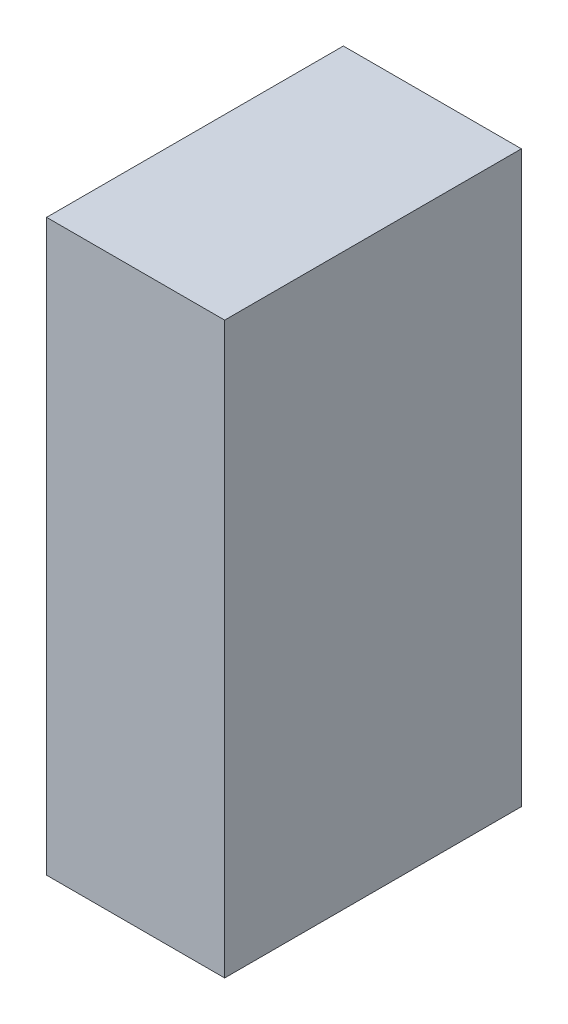
ISO-10303-21;
HEADER;
FILE_DESCRIPTION(('STEP AP214'),'2;1');
FILE_NAME('part.step','',(''),(''),'','','');
FILE_SCHEMA(('AUTOMOTIVE_DESIGN { 1 0 10303 214 1 1 1 1 }'));
ENDSEC;
DATA;
#1=APPLICATION_CONTEXT('core data for automotive mechanical design processes');
#2=APPLICATION_PROTOCOL_DEFINITION('international standard','automotive_design',2000,#1);
#3=PRODUCT_CONTEXT('',#1,'mechanical');
#4=PRODUCT('Part','Part','',(#3));
#5=PRODUCT_RELATED_PRODUCT_CATEGORY('part','',(#4));
#6=PRODUCT_DEFINITION_FORMATION('','',#4);
#7=PRODUCT_DEFINITION_CONTEXT('part definition',#1,'design');
#8=PRODUCT_DEFINITION('design','',#6,#7);
#9=PRODUCT_DEFINITION_SHAPE('','',#8);
#10=(LENGTH_UNIT() NAMED_UNIT(*) SI_UNIT(.MILLI.,.METRE.));
#11=(NAMED_UNIT(*) PLANE_ANGLE_UNIT() SI_UNIT($,.RADIAN.));
#12=(NAMED_UNIT(*) SI_UNIT($,.STERADIAN.) SOLID_ANGLE_UNIT());
#13=UNCERTAINTY_MEASURE_WITH_UNIT(LENGTH_MEASURE(1.E-05),#10,'distance_accuracy_value','');
#14=(GEOMETRIC_REPRESENTATION_CONTEXT(3) GLOBAL_UNCERTAINTY_ASSIGNED_CONTEXT((#13)) GLOBAL_UNIT_ASSIGNED_CONTEXT((#10,
#11,#12)) REPRESENTATION_CONTEXT('',''));
#15=CARTESIAN_POINT('',(0.,0.,0.));
#16=DIRECTION('',(0.,0.,1.));
#17=DIRECTION('',(1.,0.,0.));
#18=AXIS2_PLACEMENT_3D('',#15,#16,#17);
#19=CARTESIAN_POINT('',(0.,48.,0.));
#20=DIRECTION('',(1.,0.,0.));
#21=DIRECTION('',(0.,0.,-1.));
#22=AXIS2_PLACEMENT_3D('',#19,#20,#21);
#23=PLANE('',#22);
#24=DIRECTION('',(0.,0.,1.));
#25=VECTOR('',#24,1.);
#26=CARTESIAN_POINT('',(0.,0.,0.));
#27=LINE('',#26,#25);
#28=CARTESIAN_POINT('',(0.,0.,-25.));
#29=VERTEX_POINT('',#28);
#30=CARTESIAN_POINT('',(0.,0.,0.));
#31=VERTEX_POINT('',#30);
#32=EDGE_CURVE('E100',#29,#31,#27,.T.);
#33=ORIENTED_EDGE('',*,*,#32,.T.);
#34=DIRECTION('',(0.,-1.,0.));
#35=VECTOR('',#34,1.);
#36=CARTESIAN_POINT('',(0.,48.,0.));
#37=LINE('',#36,#35);
#38=CARTESIAN_POINT('',(0.,48.,0.));
#39=VERTEX_POINT('',#38);
#40=EDGE_CURVE('E11',#39,#31,#37,.T.);
#41=ORIENTED_EDGE('',*,*,#40,.F.);
#42=DIRECTION('',(0.,0.,1.));
#43=VECTOR('',#42,1.);
#44=CARTESIAN_POINT('',(0.,48.,0.));
#45=LINE('',#44,#43);
#46=CARTESIAN_POINT('',(0.,48.,-25.));
#47=VERTEX_POINT('',#46);
#48=EDGE_CURVE('E88',#47,#39,#45,.T.);
#49=ORIENTED_EDGE('',*,*,#48,.F.);
#50=DIRECTION('',(0.,-1.,0.));
#51=VECTOR('',#50,1.);
#52=CARTESIAN_POINT('',(0.,48.,-25.));
#53=LINE('',#52,#51);
#54=EDGE_CURVE('E96',#47,#29,#53,.T.);
#55=ORIENTED_EDGE('',*,*,#54,.T.);
#56=EDGE_LOOP('',(#33,#41,#49,#55));
#57=FACE_BOUND('',#56,.T.);
#58=ADVANCED_FACE('F37',(#57),#23,.F.);
#59=CARTESIAN_POINT('',(0.,48.,0.));
#60=DIRECTION('',(0.,0.,-1.));
#61=DIRECTION('',(-1.,0.,0.));
#62=AXIS2_PLACEMENT_3D('',#59,#60,#61);
#63=PLANE('',#62);
#64=DIRECTION('',(1.,0.,0.));
#65=VECTOR('',#64,1.);
#66=CARTESIAN_POINT('',(0.,0.,0.));
#67=LINE('',#66,#65);
#68=CARTESIAN_POINT('',(15.,0.,0.));
#69=VERTEX_POINT('',#68);
#70=EDGE_CURVE('E92',#31,#69,#67,.T.);
#71=ORIENTED_EDGE('',*,*,#70,.T.);
#72=DIRECTION('',(0.,-1.,0.));
#73=VECTOR('',#72,1.);
#74=CARTESIAN_POINT('',(15.,48.,0.));
#75=LINE('',#74,#73);
#76=CARTESIAN_POINT('',(15.,48.,0.));
#77=VERTEX_POINT('',#76);
#78=EDGE_CURVE('E45',#77,#69,#75,.T.);
#79=ORIENTED_EDGE('',*,*,#78,.F.);
#80=DIRECTION('',(1.,0.,0.));
#81=VECTOR('',#80,1.);
#82=CARTESIAN_POINT('',(0.,48.,0.));
#83=LINE('',#82,#81);
#84=EDGE_CURVE('E83',#39,#77,#83,.T.);
#85=ORIENTED_EDGE('',*,*,#84,.F.);
#86=ORIENTED_EDGE('',*,*,#40,.T.);
#87=EDGE_LOOP('',(#71,#79,#85,#86));
#88=FACE_BOUND('',#87,.T.);
#89=ADVANCED_FACE('F91',(#88),#63,.F.);
#90=CARTESIAN_POINT('',(15.,48.,0.));
#91=DIRECTION('',(-1.,0.,0.));
#92=DIRECTION('',(0.,0.,1.));
#93=AXIS2_PLACEMENT_3D('',#90,#91,#92);
#94=PLANE('',#93);
#95=DIRECTION('',(0.,0.,-1.));
#96=VECTOR('',#95,1.);
#97=CARTESIAN_POINT('',(15.,0.,0.));
#98=LINE('',#97,#96);
#99=CARTESIAN_POINT('',(15.,0.,-25.));
#100=VERTEX_POINT('',#99);
#101=EDGE_CURVE('E70',#69,#100,#98,.T.);
#102=ORIENTED_EDGE('',*,*,#101,.T.);
#103=DIRECTION('',(0.,-1.,0.));
#104=VECTOR('',#103,1.);
#105=CARTESIAN_POINT('',(15.,48.,-25.));
#106=LINE('',#105,#104);
#107=CARTESIAN_POINT('',(15.,48.,-25.));
#108=VERTEX_POINT('',#107);
#109=EDGE_CURVE('E93',#108,#100,#106,.T.);
#110=ORIENTED_EDGE('',*,*,#109,.F.);
#111=DIRECTION('',(0.,0.,-1.));
#112=VECTOR('',#111,1.);
#113=CARTESIAN_POINT('',(15.,48.,0.));
#114=LINE('',#113,#112);
#115=EDGE_CURVE('E86',#77,#108,#114,.T.);
#116=ORIENTED_EDGE('',*,*,#115,.F.);
#117=ORIENTED_EDGE('',*,*,#78,.T.);
#118=EDGE_LOOP('',(#102,#110,#116,#117));
#119=FACE_BOUND('',#118,.T.);
#120=ADVANCED_FACE('F94',(#119),#94,.F.);
#121=CARTESIAN_POINT('',(0.,48.,-25.));
#122=DIRECTION('',(0.,0.,1.));
#123=DIRECTION('',(1.,0.,0.));
#124=AXIS2_PLACEMENT_3D('',#121,#122,#123);
#125=PLANE('',#124);
#126=DIRECTION('',(-1.,0.,0.));
#127=VECTOR('',#126,1.);
#128=CARTESIAN_POINT('',(0.,0.,-25.));
#129=LINE('',#128,#127);
#130=EDGE_CURVE('E76',#100,#29,#129,.T.);
#131=ORIENTED_EDGE('',*,*,#130,.T.);
#132=ORIENTED_EDGE('',*,*,#54,.F.);
#133=DIRECTION('',(-1.,0.,0.));
#134=VECTOR('',#133,1.);
#135=CARTESIAN_POINT('',(0.,48.,-25.));
#136=LINE('',#135,#134);
#137=EDGE_CURVE('E53',#108,#47,#136,.T.);
#138=ORIENTED_EDGE('',*,*,#137,.F.);
#139=ORIENTED_EDGE('',*,*,#109,.T.);
#140=EDGE_LOOP('',(#131,#132,#138,#139));
#141=FACE_BOUND('',#140,.T.);
#142=ADVANCED_FACE('F107',(#141),#125,.F.);
#143=CARTESIAN_POINT('',(0.,48.,0.));
#144=DIRECTION('',(0.,-1.,0.));
#145=DIRECTION('',(0.,0.,-1.));
#146=AXIS2_PLACEMENT_3D('',#143,#144,#145);
#147=PLANE('',#146);
#148=ORIENTED_EDGE('',*,*,#48,.T.);
#149=ORIENTED_EDGE('',*,*,#84,.T.);
#150=ORIENTED_EDGE('',*,*,#115,.T.);
#151=ORIENTED_EDGE('',*,*,#137,.T.);
#152=EDGE_LOOP('',(#148,#149,#150,#151));
#153=FACE_BOUND('',#152,.T.);
#154=ADVANCED_FACE('F84',(#153),#147,.F.);
#155=CARTESIAN_POINT('',(0.,0.,0.));
#156=DIRECTION('',(0.,-1.,0.));
#157=DIRECTION('',(0.,0.,-1.));
#158=AXIS2_PLACEMENT_3D('',#155,#156,#157);
#159=PLANE('',#158);
#160=ORIENTED_EDGE('',*,*,#32,.F.);
#161=ORIENTED_EDGE('',*,*,#130,.F.);
#162=ORIENTED_EDGE('',*,*,#101,.F.);
#163=ORIENTED_EDGE('',*,*,#70,.F.);
#164=EDGE_LOOP('',(#160,#161,#162,#163));
#165=FACE_BOUND('',#164,.T.);
#166=ADVANCED_FACE('F110',(#165),#159,.T.);
#167=CLOSED_SHELL('',(#58,#89,#120,#142,#154,#166));
#168=MANIFOLD_SOLID_BREP('B2',#167);
#169=ADVANCED_BREP_SHAPE_REPRESENTATION('',(#18,#168),#14);
#170=SHAPE_DEFINITION_REPRESENTATION(#9,#169);
ENDSEC;
END-ISO-10303-21;
